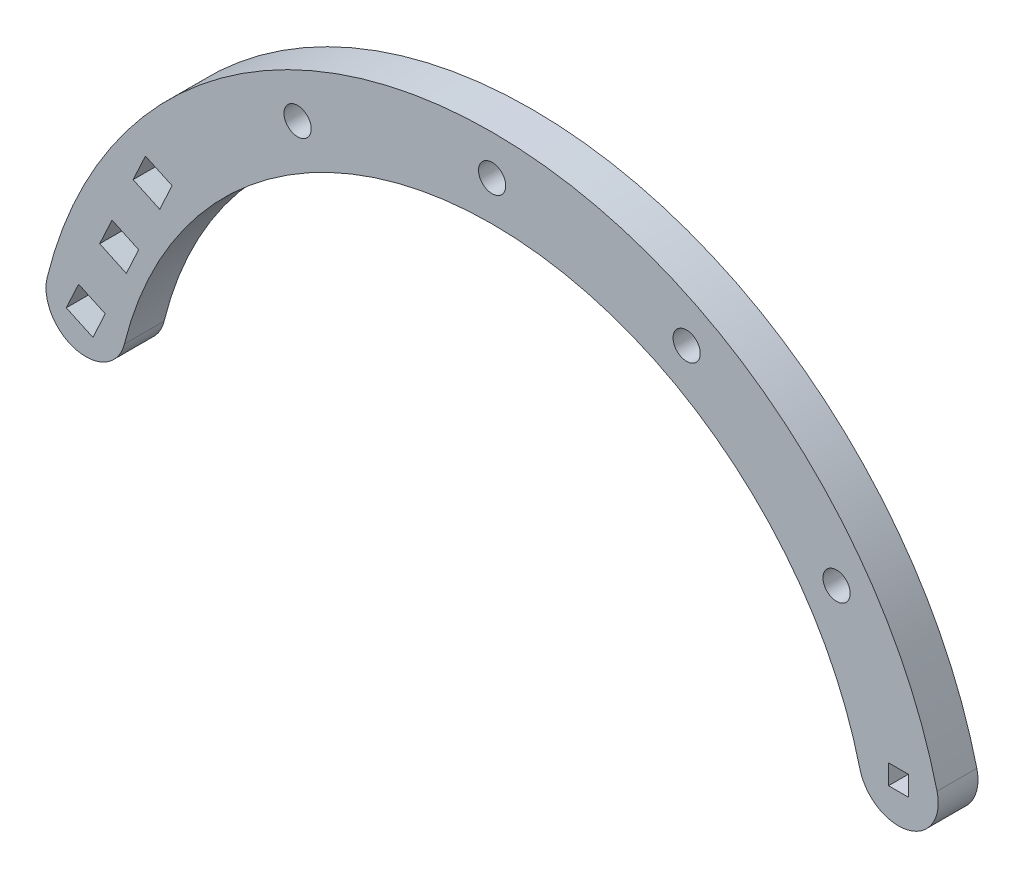
ISO-10303-21;
HEADER;
FILE_DESCRIPTION(('STEP AP214'),'2;1');
FILE_NAME('part.step','',(''),(''),'','','');
FILE_SCHEMA(('AUTOMOTIVE_DESIGN { 1 0 10303 214 1 1 1 1 }'));
ENDSEC;
DATA;
#1=APPLICATION_CONTEXT('core data for automotive mechanical design processes');
#2=APPLICATION_PROTOCOL_DEFINITION('international standard','automotive_design',2000,#1);
#3=PRODUCT_CONTEXT('',#1,'mechanical');
#4=PRODUCT('Part','Part','',(#3));
#5=PRODUCT_RELATED_PRODUCT_CATEGORY('part','',(#4));
#6=PRODUCT_DEFINITION_FORMATION('','',#4);
#7=PRODUCT_DEFINITION_CONTEXT('part definition',#1,'design');
#8=PRODUCT_DEFINITION('design','',#6,#7);
#9=PRODUCT_DEFINITION_SHAPE('','',#8);
#10=(LENGTH_UNIT() NAMED_UNIT(*) SI_UNIT(.MILLI.,.METRE.));
#11=(NAMED_UNIT(*) PLANE_ANGLE_UNIT() SI_UNIT($,.RADIAN.));
#12=(NAMED_UNIT(*) SI_UNIT($,.STERADIAN.) SOLID_ANGLE_UNIT());
#13=UNCERTAINTY_MEASURE_WITH_UNIT(LENGTH_MEASURE(1.E-05),#10,'distance_accuracy_value','');
#14=(GEOMETRIC_REPRESENTATION_CONTEXT(3) GLOBAL_UNCERTAINTY_ASSIGNED_CONTEXT((#13)) GLOBAL_UNIT_ASSIGNED_CONTEXT((#10,
#11,#12)) REPRESENTATION_CONTEXT('',''));
#15=CARTESIAN_POINT('',(0.,0.,0.));
#16=DIRECTION('',(0.,0.,1.));
#17=DIRECTION('',(1.,0.,0.));
#18=AXIS2_PLACEMENT_3D('',#15,#16,#17);
#19=CARTESIAN_POINT('',(97.32645,-8.01836804374999,6.35));
#20=DIRECTION('',(0.,0.,1.));
#21=DIRECTION('',(1.,0.,0.));
#22=AXIS2_PLACEMENT_3D('',#19,#20,#21);
#23=PLANE('',#22);
#24=CARTESIAN_POINT('',(119.889855449003,21.9308574703804,6.35));
#25=DIRECTION('',(0.,0.,1.));
#26=DIRECTION('',(1.,0.,0.));
#27=AXIS2_PLACEMENT_3D('',#24,#25,#26);
#28=CIRCLE('',#27,2.17169999999999);
#29=CARTESIAN_POINT('',(122.061555449003,21.9308574703804,6.35));
#30=VERTEX_POINT('',#29);
#31=EDGE_CURVE('E211',#30,#30,#28,.T.);
#32=ORIENTED_EDGE('',*,*,#31,.F.);
#33=EDGE_LOOP('',(#32));
#34=FACE_BOUND('',#33,.T.);
#35=CARTESIAN_POINT('',(64.8843,50.8,6.35));
#36=DIRECTION('',(0.,0.,1.));
#37=DIRECTION('',(1.,0.,0.));
#38=AXIS2_PLACEMENT_3D('',#35,#36,#37);
#39=CIRCLE('',#38,2.1717);
#40=CARTESIAN_POINT('',(67.056,50.8,6.35));
#41=VERTEX_POINT('',#40);
#42=EDGE_CURVE('E667',#41,#41,#39,.T.);
#43=ORIENTED_EDGE('',*,*,#42,.F.);
#44=EDGE_LOOP('',(#43));
#45=FACE_BOUND('',#44,.T.);
#46=CARTESIAN_POINT('',(95.944880003634,43.1442546161689,6.35));
#47=DIRECTION('',(0.,0.,1.));
#48=DIRECTION('',(1.,0.,0.));
#49=AXIS2_PLACEMENT_3D('',#46,#47,#48);
#50=CIRCLE('',#49,2.1717);
#51=CARTESIAN_POINT('',(98.116580003634,43.1442546161689,6.35));
#52=VERTEX_POINT('',#51);
#53=EDGE_CURVE('E651',#52,#52,#50,.T.);
#54=ORIENTED_EDGE('',*,*,#53,.F.);
#55=EDGE_LOOP('',(#54));
#56=FACE_BOUND('',#55,.T.);
#57=CARTESIAN_POINT('',(33.8237199963643,43.144254616172,6.35));
#58=DIRECTION('',(0.,0.,1.));
#59=DIRECTION('',(1.,0.,0.));
#60=AXIS2_PLACEMENT_3D('',#57,#58,#59);
#61=CIRCLE('',#60,2.17169999999999);
#62=CARTESIAN_POINT('',(35.9954199963643,43.144254616172,6.35));
#63=VERTEX_POINT('',#62);
#64=EDGE_CURVE('E645',#63,#63,#61,.T.);
#65=ORIENTED_EDGE('',*,*,#64,.F.);
#66=EDGE_LOOP('',(#65));
#67=FACE_BOUND('',#66,.T.);
#68=CARTESIAN_POINT('',(129.7686,0.,6.35));
#69=DIRECTION('',(0.,0.,1.));
#70=DIRECTION('',(1.,0.,0.));
#71=AXIS2_PLACEMENT_3D('',#68,#69,#70);
#72=CIRCLE('',#71,6.34999999999997);
#73=CARTESIAN_POINT('',(123.604096328537,-1.52361231437618,6.35));
#74=VERTEX_POINT('',#73);
#75=CARTESIAN_POINT('',(135.933103671463,1.52361231437615,6.35));
#76=VERTEX_POINT('',#75);
#77=EDGE_CURVE('E356',#74,#76,#72,.T.);
#78=ORIENTED_EDGE('',*,*,#77,.T.);
#79=CARTESIAN_POINT('',(64.8843,-16.0367360875,6.35));
#80=DIRECTION('',(0.,0.,1.));
#81=DIRECTION('',(1.,0.,0.));
#82=AXIS2_PLACEMENT_3D('',#79,#80,#81);
#83=CIRCLE('',#82,73.1867360874999);
#84=CARTESIAN_POINT('',(-6.16450367146296,1.52361231437616,6.35));
#85=VERTEX_POINT('',#84);
#86=EDGE_CURVE('E360',#76,#85,#83,.T.);
#87=ORIENTED_EDGE('',*,*,#86,.T.);
#88=CARTESIAN_POINT('',(0.,0.,6.35));
#89=DIRECTION('',(0.,0.,1.));
#90=DIRECTION('',(1.,0.,0.));
#91=AXIS2_PLACEMENT_3D('',#88,#89,#90);
#92=CIRCLE('',#91,6.34999999999997);
#93=CARTESIAN_POINT('',(6.164503671463,-1.52361231437617,6.35));
#94=VERTEX_POINT('',#93);
#95=EDGE_CURVE('E364',#85,#94,#92,.T.);
#96=ORIENTED_EDGE('',*,*,#95,.T.);
#97=CARTESIAN_POINT('',(64.8843,-16.0367360875,6.35));
#98=DIRECTION('',(0.,0.,-1.));
#99=DIRECTION('',(1.,0.,0.));
#100=AXIS2_PLACEMENT_3D('',#97,#98,#99);
#101=CIRCLE('',#100,60.4867360875);
#102=EDGE_CURVE('E367',#94,#74,#101,.T.);
#103=ORIENTED_EDGE('',*,*,#102,.T.);
#104=EDGE_LOOP('',(#78,#87,#96,#103));
#105=FACE_BOUND('',#104,.T.);
#106=DIRECTION('',(-1.,0.,0.));
#107=VECTOR('',#106,1.);
#108=CARTESIAN_POINT('',(128.1811,1.5875,6.35));
#109=LINE('',#108,#107);
#110=CARTESIAN_POINT('',(131.3561,1.5875,6.35));
#111=VERTEX_POINT('',#110);
#112=CARTESIAN_POINT('',(128.1811,1.5875,6.35));
#113=VERTEX_POINT('',#112);
#114=EDGE_CURVE('E316',#111,#113,#109,.T.);
#115=ORIENTED_EDGE('',*,*,#114,.F.);
#116=DIRECTION('',(0.,1.,0.));
#117=VECTOR('',#116,1.);
#118=CARTESIAN_POINT('',(131.3561,1.5875,6.35));
#119=LINE('',#118,#117);
#120=CARTESIAN_POINT('',(131.3561,-1.5875,6.35));
#121=VERTEX_POINT('',#120);
#122=EDGE_CURVE('E313',#121,#111,#119,.T.);
#123=ORIENTED_EDGE('',*,*,#122,.F.);
#124=DIRECTION('',(1.,0.,0.));
#125=VECTOR('',#124,1.);
#126=CARTESIAN_POINT('',(128.1811,-1.5875,6.35));
#127=LINE('',#126,#125);
#128=CARTESIAN_POINT('',(128.1811,-1.5875,6.35));
#129=VERTEX_POINT('',#128);
#130=EDGE_CURVE('E324',#129,#121,#127,.T.);
#131=ORIENTED_EDGE('',*,*,#130,.F.);
#132=DIRECTION('',(0.,-1.,0.));
#133=VECTOR('',#132,1.);
#134=CARTESIAN_POINT('',(128.1811,1.5875,6.35));
#135=LINE('',#134,#133);
#136=EDGE_CURVE('E320',#113,#129,#135,.T.);
#137=ORIENTED_EDGE('',*,*,#136,.F.);
#138=EDGE_LOOP('',(#115,#123,#131,#137));
#139=FACE_BOUND('',#138,.T.);
#140=DIRECTION('',(-0.907509263750891,0.420032065688222,0.));
#141=VECTOR('',#140,1.);
#142=CARTESIAN_POINT('',(-1.14249534054006,3.11134508298281,6.35));
#143=LINE('',#142,#141);
#144=CARTESIAN_POINT('',(3.11134508298281,1.14249534054004,6.35));
#145=VERTEX_POINT('',#144);
#146=CARTESIAN_POINT('',(-1.14249534054006,3.11134508298281,6.35));
#147=VERTEX_POINT('',#146);
#148=EDGE_CURVE('E273',#145,#147,#143,.T.);
#149=ORIENTED_EDGE('',*,*,#148,.F.);
#150=DIRECTION('',(0.420032065688224,0.907509263750891,0.));
#151=VECTOR('',#150,1.);
#152=CARTESIAN_POINT('',(3.11134508298281,1.14249534054004,6.35));
#153=LINE('',#152,#151);
#154=CARTESIAN_POINT('',(1.14249534054003,-3.11134508298283,6.35));
#155=VERTEX_POINT('',#154);
#156=EDGE_CURVE('E270',#155,#145,#153,.T.);
#157=ORIENTED_EDGE('',*,*,#156,.F.);
#158=DIRECTION('',(0.907509263750891,-0.420032065688222,0.));
#159=VECTOR('',#158,1.);
#160=CARTESIAN_POINT('',(-3.11134508298284,-1.14249534054006,6.35));
#161=LINE('',#160,#159);
#162=CARTESIAN_POINT('',(-3.11134508298284,-1.14249534054007,6.35));
#163=VERTEX_POINT('',#162);
#164=EDGE_CURVE('E281',#163,#155,#161,.T.);
#165=ORIENTED_EDGE('',*,*,#164,.F.);
#166=DIRECTION('',(-0.420032065688223,-0.907509263750891,0.));
#167=VECTOR('',#166,1.);
#168=CARTESIAN_POINT('',(-1.14249534054006,3.11134508298281,6.35));
#169=LINE('',#168,#167);
#170=EDGE_CURVE('E277',#147,#163,#169,.T.);
#171=ORIENTED_EDGE('',*,*,#170,.F.);
#172=EDGE_LOOP('',(#149,#157,#165,#171));
#173=FACE_BOUND('',#172,.T.);
#174=DIRECTION('',(0.420032065688224,0.907509263750891,0.));
#175=VECTOR('',#174,1.);
#176=CARTESIAN_POINT('',(8.44575261120674,12.6678632248463,6.35));
#177=LINE('',#176,#175);
#178=CARTESIAN_POINT('',(6.47690272744515,8.41402249599407,6.35));
#179=VERTEX_POINT('',#178);
#180=CARTESIAN_POINT('',(8.44575261120674,12.6678632248463,6.35));
#181=VERTEX_POINT('',#180);
#182=EDGE_CURVE('E230',#179,#181,#177,.T.);
#183=ORIENTED_EDGE('',*,*,#182,.F.);
#184=DIRECTION('',(0.907509263750891,-0.420032065688224,0.));
#185=VECTOR('',#184,1.);
#186=CARTESIAN_POINT('',(2.22306199859291,10.3828723797557,6.35));
#187=LINE('',#186,#185);
#188=CARTESIAN_POINT('',(2.22306199859291,10.3828723797557,6.35));
#189=VERTEX_POINT('',#188);
#190=EDGE_CURVE('E227',#189,#179,#187,.T.);
#191=ORIENTED_EDGE('',*,*,#190,.F.);
#192=DIRECTION('',(-0.420032065688223,-0.907509263750891,0.));
#193=VECTOR('',#192,1.);
#194=CARTESIAN_POINT('',(4.1919118823545,14.6367131086079,6.35));
#195=LINE('',#194,#193);
#196=CARTESIAN_POINT('',(4.19191188235448,14.6367131086079,6.35));
#197=VERTEX_POINT('',#196);
#198=EDGE_CURVE('E238',#197,#189,#195,.T.);
#199=ORIENTED_EDGE('',*,*,#198,.F.);
#200=DIRECTION('',(-0.907509263750891,0.420032065688223,0.));
#201=VECTOR('',#200,1.);
#202=CARTESIAN_POINT('',(4.1919118823545,14.6367131086079,6.35));
#203=LINE('',#202,#201);
#204=EDGE_CURVE('E234',#181,#197,#203,.T.);
#205=ORIENTED_EDGE('',*,*,#204,.F.);
#206=EDGE_LOOP('',(#183,#191,#199,#205));
#207=FACE_BOUND('',#206,.T.);
#208=DIRECTION('',(0.420032065688209,0.907509263750898,0.));
#209=VECTOR('',#208,1.);
#210=CARTESIAN_POINT('',(13.780159856793,24.1932304984939,6.35));
#211=LINE('',#210,#209);
#212=CARTESIAN_POINT('',(11.8113101143503,19.939390074971,6.35));
#213=VERTEX_POINT('',#212);
#214=CARTESIAN_POINT('',(13.780159856793,24.1932304984939,6.35));
#215=VERTEX_POINT('',#214);
#216=EDGE_CURVE('E186',#213,#215,#211,.T.);
#217=ORIENTED_EDGE('',*,*,#216,.F.);
#218=DIRECTION('',(0.907509263750891,-0.420032065688223,0.));
#219=VECTOR('',#218,1.);
#220=CARTESIAN_POINT('',(7.5574690801687,21.9082401000514,6.35));
#221=LINE('',#220,#219);
#222=CARTESIAN_POINT('',(7.5574690801687,21.9082401000514,6.35));
#223=VERTEX_POINT('',#222);
#224=EDGE_CURVE('E177',#223,#213,#221,.T.);
#225=ORIENTED_EDGE('',*,*,#224,.F.);
#226=DIRECTION('',(-0.420032195965406,-0.90750920345332,0.));
#227=VECTOR('',#226,1.);
#228=CARTESIAN_POINT('',(9.52631971590778,26.1620808515953,6.35));
#229=LINE('',#228,#227);
#230=CARTESIAN_POINT('',(9.52631971590778,26.1620808515953,6.35));
#231=VERTEX_POINT('',#230);
#232=EDGE_CURVE('E203',#231,#223,#229,.T.);
#233=ORIENTED_EDGE('',*,*,#232,.F.);
#234=DIRECTION('',(-0.907509203453318,0.42003219596541,0.));
#235=VECTOR('',#234,1.);
#236=CARTESIAN_POINT('',(9.52631971590778,26.1620808515953,6.35));
#237=LINE('',#236,#235);
#238=EDGE_CURVE('E199',#215,#231,#237,.T.);
#239=ORIENTED_EDGE('',*,*,#238,.F.);
#240=EDGE_LOOP('',(#217,#225,#233,#239));
#241=FACE_BOUND('',#240,.T.);
#242=ADVANCED_FACE('F39',(#34,#45,#56,#67,#105,#139,#173,#207,#241),#23,.T.);
#243=CARTESIAN_POINT('',(97.32645,-8.01836804374999,0.));
#244=DIRECTION('',(0.,0.,1.));
#245=DIRECTION('',(1.,0.,0.));
#246=AXIS2_PLACEMENT_3D('',#243,#244,#245);
#247=PLANE('',#246);
#248=CARTESIAN_POINT('',(119.889855449003,21.9308574703804,0.));
#249=DIRECTION('',(0.,0.,-1.));
#250=DIRECTION('',(-1.,0.,0.));
#251=AXIS2_PLACEMENT_3D('',#248,#249,#250);
#252=CIRCLE('',#251,2.17169999999999);
#253=CARTESIAN_POINT('',(117.718155449003,21.9308574703804,0.));
#254=VERTEX_POINT('',#253);
#255=EDGE_CURVE('E643',#254,#254,#252,.T.);
#256=ORIENTED_EDGE('',*,*,#255,.F.);
#257=EDGE_LOOP('',(#256));
#258=FACE_BOUND('',#257,.T.);
#259=CARTESIAN_POINT('',(64.8843,50.8,0.));
#260=DIRECTION('',(0.,0.,-1.));
#261=DIRECTION('',(-1.,0.,0.));
#262=AXIS2_PLACEMENT_3D('',#259,#260,#261);
#263=CIRCLE('',#262,2.1717);
#264=CARTESIAN_POINT('',(62.7126,50.8,0.));
#265=VERTEX_POINT('',#264);
#266=EDGE_CURVE('E646',#265,#265,#263,.T.);
#267=ORIENTED_EDGE('',*,*,#266,.F.);
#268=EDGE_LOOP('',(#267));
#269=FACE_BOUND('',#268,.T.);
#270=CARTESIAN_POINT('',(95.944880003634,43.1442546161689,0.));
#271=DIRECTION('',(0.,0.,-1.));
#272=DIRECTION('',(-1.,0.,0.));
#273=AXIS2_PLACEMENT_3D('',#270,#271,#272);
#274=CIRCLE('',#273,2.1717);
#275=CARTESIAN_POINT('',(93.773180003634,43.1442546161689,0.));
#276=VERTEX_POINT('',#275);
#277=EDGE_CURVE('E654',#276,#276,#274,.T.);
#278=ORIENTED_EDGE('',*,*,#277,.F.);
#279=EDGE_LOOP('',(#278));
#280=FACE_BOUND('',#279,.T.);
#281=CARTESIAN_POINT('',(33.8237199963643,43.144254616172,0.));
#282=DIRECTION('',(0.,0.,-1.));
#283=DIRECTION('',(-1.,0.,0.));
#284=AXIS2_PLACEMENT_3D('',#281,#282,#283);
#285=CIRCLE('',#284,2.17169999999999);
#286=CARTESIAN_POINT('',(31.6520199963643,43.144254616172,0.));
#287=VERTEX_POINT('',#286);
#288=EDGE_CURVE('E660',#287,#287,#285,.T.);
#289=ORIENTED_EDGE('',*,*,#288,.F.);
#290=EDGE_LOOP('',(#289));
#291=FACE_BOUND('',#290,.T.);
#292=DIRECTION('',(0.907509263750891,-0.420032065688224,0.));
#293=VECTOR('',#292,1.);
#294=CARTESIAN_POINT('',(2.22306199859291,10.3828723797557,0.));
#295=LINE('',#294,#293);
#296=CARTESIAN_POINT('',(2.2230619985929,10.3828723797557,0.));
#297=VERTEX_POINT('',#296);
#298=CARTESIAN_POINT('',(6.47690272744515,8.41402249599407,0.));
#299=VERTEX_POINT('',#298);
#300=EDGE_CURVE('E195',#297,#299,#295,.T.);
#301=ORIENTED_EDGE('',*,*,#300,.T.);
#302=DIRECTION('',(0.420032065688224,0.907509263750891,0.));
#303=VECTOR('',#302,1.);
#304=CARTESIAN_POINT('',(8.44575261120674,12.6678632248463,0.));
#305=LINE('',#304,#303);
#306=CARTESIAN_POINT('',(8.44575261120674,12.6678632248463,0.));
#307=VERTEX_POINT('',#306);
#308=EDGE_CURVE('E245',#299,#307,#305,.T.);
#309=ORIENTED_EDGE('',*,*,#308,.T.);
#310=DIRECTION('',(-0.907509263750891,0.420032065688223,0.));
#311=VECTOR('',#310,1.);
#312=CARTESIAN_POINT('',(4.1919118823545,14.6367131086079,0.));
#313=LINE('',#312,#311);
#314=CARTESIAN_POINT('',(4.1919118823545,14.6367131086079,0.));
#315=VERTEX_POINT('',#314);
#316=EDGE_CURVE('E249',#307,#315,#313,.T.);
#317=ORIENTED_EDGE('',*,*,#316,.T.);
#318=DIRECTION('',(-0.420032065688223,-0.907509263750891,0.));
#319=VECTOR('',#318,1.);
#320=CARTESIAN_POINT('',(4.1919118823545,14.6367131086079,0.));
#321=LINE('',#320,#319);
#322=EDGE_CURVE('E231',#315,#297,#321,.T.);
#323=ORIENTED_EDGE('',*,*,#322,.T.);
#324=EDGE_LOOP('',(#301,#309,#317,#323));
#325=FACE_BOUND('',#324,.T.);
#326=DIRECTION('',(0.,1.,0.));
#327=VECTOR('',#326,1.);
#328=CARTESIAN_POINT('',(131.3561,1.5875,0.));
#329=LINE('',#328,#327);
#330=CARTESIAN_POINT('',(131.3561,-1.5875,0.));
#331=VERTEX_POINT('',#330);
#332=CARTESIAN_POINT('',(131.3561,1.5875,0.));
#333=VERTEX_POINT('',#332);
#334=EDGE_CURVE('E312',#331,#333,#329,.T.);
#335=ORIENTED_EDGE('',*,*,#334,.T.);
#336=DIRECTION('',(-1.,0.,0.));
#337=VECTOR('',#336,1.);
#338=CARTESIAN_POINT('',(128.1811,1.5875,0.));
#339=LINE('',#338,#337);
#340=CARTESIAN_POINT('',(128.1811,1.5875,0.));
#341=VERTEX_POINT('',#340);
#342=EDGE_CURVE('E331',#333,#341,#339,.T.);
#343=ORIENTED_EDGE('',*,*,#342,.T.);
#344=DIRECTION('',(0.,-1.,0.));
#345=VECTOR('',#344,1.);
#346=CARTESIAN_POINT('',(128.1811,1.5875,0.));
#347=LINE('',#346,#345);
#348=CARTESIAN_POINT('',(128.1811,-1.5875,0.));
#349=VERTEX_POINT('',#348);
#350=EDGE_CURVE('E335',#341,#349,#347,.T.);
#351=ORIENTED_EDGE('',*,*,#350,.T.);
#352=DIRECTION('',(1.,0.,0.));
#353=VECTOR('',#352,1.);
#354=CARTESIAN_POINT('',(128.1811,-1.5875,0.));
#355=LINE('',#354,#353);
#356=EDGE_CURVE('E317',#349,#331,#355,.T.);
#357=ORIENTED_EDGE('',*,*,#356,.T.);
#358=EDGE_LOOP('',(#335,#343,#351,#357));
#359=FACE_BOUND('',#358,.T.);
#360=CARTESIAN_POINT('',(129.7686,0.,0.));
#361=DIRECTION('',(0.,0.,1.));
#362=DIRECTION('',(1.,0.,0.));
#363=AXIS2_PLACEMENT_3D('',#360,#361,#362);
#364=CIRCLE('',#363,6.34999999999997);
#365=CARTESIAN_POINT('',(123.604096328537,-1.52361231437618,0.));
#366=VERTEX_POINT('',#365);
#367=CARTESIAN_POINT('',(135.933103671463,1.52361231437615,0.));
#368=VERTEX_POINT('',#367);
#369=EDGE_CURVE('E355',#366,#368,#364,.T.);
#370=ORIENTED_EDGE('',*,*,#369,.F.);
#371=CARTESIAN_POINT('',(64.8843,-16.0367360875,0.));
#372=DIRECTION('',(0.,0.,-1.));
#373=DIRECTION('',(1.,0.,0.));
#374=AXIS2_PLACEMENT_3D('',#371,#372,#373);
#375=CIRCLE('',#374,60.4867360875);
#376=CARTESIAN_POINT('',(6.164503671463,-1.52361231437617,0.));
#377=VERTEX_POINT('',#376);
#378=EDGE_CURVE('E361',#377,#366,#375,.T.);
#379=ORIENTED_EDGE('',*,*,#378,.F.);
#380=CARTESIAN_POINT('',(0.,0.,0.));
#381=DIRECTION('',(0.,0.,1.));
#382=DIRECTION('',(1.,0.,0.));
#383=AXIS2_PLACEMENT_3D('',#380,#381,#382);
#384=CIRCLE('',#383,6.34999999999997);
#385=CARTESIAN_POINT('',(-6.16450367146296,1.52361231437616,0.));
#386=VERTEX_POINT('',#385);
#387=EDGE_CURVE('E377',#386,#377,#384,.T.);
#388=ORIENTED_EDGE('',*,*,#387,.F.);
#389=CARTESIAN_POINT('',(64.8843,-16.0367360875,0.));
#390=DIRECTION('',(0.,0.,1.));
#391=DIRECTION('',(1.,0.,0.));
#392=AXIS2_PLACEMENT_3D('',#389,#390,#391);
#393=CIRCLE('',#392,73.1867360874999);
#394=EDGE_CURVE('E374',#368,#386,#393,.T.);
#395=ORIENTED_EDGE('',*,*,#394,.F.);
#396=EDGE_LOOP('',(#370,#379,#388,#395));
#397=FACE_BOUND('',#396,.T.);
#398=DIRECTION('',(0.420032065688224,0.907509263750891,0.));
#399=VECTOR('',#398,1.);
#400=CARTESIAN_POINT('',(3.11134508298281,1.14249534054004,0.));
#401=LINE('',#400,#399);
#402=CARTESIAN_POINT('',(1.14249534054002,-3.11134508298284,0.));
#403=VERTEX_POINT('',#402);
#404=CARTESIAN_POINT('',(3.11134508298281,1.14249534054004,0.));
#405=VERTEX_POINT('',#404);
#406=EDGE_CURVE('E269',#403,#405,#401,.T.);
#407=ORIENTED_EDGE('',*,*,#406,.T.);
#408=DIRECTION('',(-0.907509263750891,0.420032065688222,0.));
#409=VECTOR('',#408,1.);
#410=CARTESIAN_POINT('',(-1.14249534054006,3.11134508298281,0.));
#411=LINE('',#410,#409);
#412=CARTESIAN_POINT('',(-1.14249534054006,3.11134508298281,0.));
#413=VERTEX_POINT('',#412);
#414=EDGE_CURVE('E288',#405,#413,#411,.T.);
#415=ORIENTED_EDGE('',*,*,#414,.T.);
#416=DIRECTION('',(-0.420032065688223,-0.907509263750891,0.));
#417=VECTOR('',#416,1.);
#418=CARTESIAN_POINT('',(-1.14249534054006,3.11134508298281,0.));
#419=LINE('',#418,#417);
#420=CARTESIAN_POINT('',(-3.11134508298284,-1.14249534054006,0.));
#421=VERTEX_POINT('',#420);
#422=EDGE_CURVE('E292',#413,#421,#419,.T.);
#423=ORIENTED_EDGE('',*,*,#422,.T.);
#424=DIRECTION('',(0.907509263750891,-0.420032065688222,0.));
#425=VECTOR('',#424,1.);
#426=CARTESIAN_POINT('',(-3.11134508298284,-1.14249534054006,0.));
#427=LINE('',#426,#425);
#428=EDGE_CURVE('E274',#421,#403,#427,.T.);
#429=ORIENTED_EDGE('',*,*,#428,.T.);
#430=EDGE_LOOP('',(#407,#415,#423,#429));
#431=FACE_BOUND('',#430,.T.);
#432=DIRECTION('',(0.907509263750891,-0.420032065688223,0.));
#433=VECTOR('',#432,1.);
#434=CARTESIAN_POINT('',(7.5574690801687,21.9082401000514,0.));
#435=LINE('',#434,#433);
#436=CARTESIAN_POINT('',(7.5574690801687,21.9082401000514,0.));
#437=VERTEX_POINT('',#436);
#438=CARTESIAN_POINT('',(11.8113101143503,19.939390074971,0.));
#439=VERTEX_POINT('',#438);
#440=EDGE_CURVE('E63',#437,#439,#435,.T.);
#441=ORIENTED_EDGE('',*,*,#440,.T.);
#442=DIRECTION('',(0.420032065688209,0.907509263750898,0.));
#443=VECTOR('',#442,1.);
#444=CARTESIAN_POINT('',(13.780159856793,24.1932304984939,0.));
#445=LINE('',#444,#443);
#446=CARTESIAN_POINT('',(13.780159856793,24.1932304984939,0.));
#447=VERTEX_POINT('',#446);
#448=EDGE_CURVE('E193',#439,#447,#445,.T.);
#449=ORIENTED_EDGE('',*,*,#448,.T.);
#450=DIRECTION('',(-0.907509203453318,0.42003219596541,0.));
#451=VECTOR('',#450,1.);
#452=CARTESIAN_POINT('',(9.52631971590778,26.1620808515953,0.));
#453=LINE('',#452,#451);
#454=CARTESIAN_POINT('',(9.52631971590778,26.1620808515953,0.));
#455=VERTEX_POINT('',#454);
#456=EDGE_CURVE('E214',#447,#455,#453,.T.);
#457=ORIENTED_EDGE('',*,*,#456,.T.);
#458=DIRECTION('',(-0.420032195965406,-0.90750920345332,0.));
#459=VECTOR('',#458,1.);
#460=CARTESIAN_POINT('',(9.52631971590778,26.1620808515953,0.));
#461=LINE('',#460,#459);
#462=EDGE_CURVE('E187',#455,#437,#461,.T.);
#463=ORIENTED_EDGE('',*,*,#462,.T.);
#464=EDGE_LOOP('',(#441,#449,#457,#463));
#465=FACE_BOUND('',#464,.T.);
#466=ADVANCED_FACE('F400',(#258,#269,#280,#291,#325,#359,#397,#431,#465),#247,.F.);
#467=CARTESIAN_POINT('',(129.7686,0.,6.35));
#468=DIRECTION('',(0.,0.,-1.));
#469=DIRECTION('',(-1.,0.,0.));
#470=AXIS2_PLACEMENT_3D('',#467,#468,#469);
#471=CYLINDRICAL_SURFACE('',#470,6.34999999999997);
#472=ORIENTED_EDGE('',*,*,#369,.T.);
#473=DIRECTION('',(0.,0.,-1.));
#474=VECTOR('',#473,1.);
#475=CARTESIAN_POINT('',(135.933103671463,1.52361231437615,6.35));
#476=LINE('',#475,#474);
#477=EDGE_CURVE('E11',#76,#368,#476,.T.);
#478=ORIENTED_EDGE('',*,*,#477,.F.);
#479=ORIENTED_EDGE('',*,*,#77,.F.);
#480=DIRECTION('',(0.,0.,-1.));
#481=VECTOR('',#480,1.);
#482=CARTESIAN_POINT('',(123.604096328537,-1.52361231437618,6.35));
#483=LINE('',#482,#481);
#484=EDGE_CURVE('E370',#74,#366,#483,.T.);
#485=ORIENTED_EDGE('',*,*,#484,.T.);
#486=EDGE_LOOP('',(#472,#478,#479,#485));
#487=FACE_BOUND('',#486,.T.);
#488=ADVANCED_FACE('F41',(#487),#471,.T.);
#489=CARTESIAN_POINT('',(64.8843,-16.0367360875,6.35));
#490=DIRECTION('',(0.,0.,-1.));
#491=DIRECTION('',(-1.,0.,0.));
#492=AXIS2_PLACEMENT_3D('',#489,#490,#491);
#493=CYLINDRICAL_SURFACE('',#492,73.1867360874999);
#494=ORIENTED_EDGE('',*,*,#394,.T.);
#495=DIRECTION('',(0.,0.,-1.));
#496=VECTOR('',#495,1.);
#497=CARTESIAN_POINT('',(-6.16450367146296,1.52361231437616,6.35));
#498=LINE('',#497,#496);
#499=EDGE_CURVE('E48',#85,#386,#498,.T.);
#500=ORIENTED_EDGE('',*,*,#499,.F.);
#501=ORIENTED_EDGE('',*,*,#86,.F.);
#502=ORIENTED_EDGE('',*,*,#477,.T.);
#503=EDGE_LOOP('',(#494,#500,#501,#502));
#504=FACE_BOUND('',#503,.T.);
#505=ADVANCED_FACE('F411',(#504),#493,.T.);
#506=CARTESIAN_POINT('',(0.,0.,6.35));
#507=DIRECTION('',(0.,0.,-1.));
#508=DIRECTION('',(-1.,0.,0.));
#509=AXIS2_PLACEMENT_3D('',#506,#507,#508);
#510=CYLINDRICAL_SURFACE('',#509,6.34999999999997);
#511=ORIENTED_EDGE('',*,*,#387,.T.);
#512=DIRECTION('',(0.,0.,-1.));
#513=VECTOR('',#512,1.);
#514=CARTESIAN_POINT('',(6.164503671463,-1.52361231437617,6.35));
#515=LINE('',#514,#513);
#516=EDGE_CURVE('E385',#94,#377,#515,.T.);
#517=ORIENTED_EDGE('',*,*,#516,.F.);
#518=ORIENTED_EDGE('',*,*,#95,.F.);
#519=ORIENTED_EDGE('',*,*,#499,.T.);
#520=EDGE_LOOP('',(#511,#517,#518,#519));
#521=FACE_BOUND('',#520,.T.);
#522=ADVANCED_FACE('F394',(#521),#510,.T.);
#523=CARTESIAN_POINT('',(64.8843,-16.0367360875,6.35));
#524=DIRECTION('',(0.,0.,-1.));
#525=DIRECTION('',(-1.,0.,0.));
#526=AXIS2_PLACEMENT_3D('',#523,#524,#525);
#527=CYLINDRICAL_SURFACE('',#526,60.4867360875);
#528=ORIENTED_EDGE('',*,*,#378,.T.);
#529=ORIENTED_EDGE('',*,*,#484,.F.);
#530=ORIENTED_EDGE('',*,*,#102,.F.);
#531=ORIENTED_EDGE('',*,*,#516,.T.);
#532=EDGE_LOOP('',(#528,#529,#530,#531));
#533=FACE_BOUND('',#532,.T.);
#534=ADVANCED_FACE('F404',(#533),#527,.F.);
#535=CARTESIAN_POINT('',(131.3561,1.5875,6.35));
#536=DIRECTION('',(-1.,0.,0.));
#537=DIRECTION('',(0.,0.,1.));
#538=AXIS2_PLACEMENT_3D('',#535,#536,#537);
#539=PLANE('',#538);
#540=ORIENTED_EDGE('',*,*,#334,.F.);
#541=DIRECTION('',(0.,0.,-1.));
#542=VECTOR('',#541,1.);
#543=CARTESIAN_POINT('',(131.3561,-1.5875,6.35));
#544=LINE('',#543,#542);
#545=EDGE_CURVE('E327',#121,#331,#544,.T.);
#546=ORIENTED_EDGE('',*,*,#545,.F.);
#547=ORIENTED_EDGE('',*,*,#122,.T.);
#548=DIRECTION('',(0.,0.,-1.));
#549=VECTOR('',#548,1.);
#550=CARTESIAN_POINT('',(131.3561,1.5875,6.35));
#551=LINE('',#550,#549);
#552=EDGE_CURVE('E351',#111,#333,#551,.T.);
#553=ORIENTED_EDGE('',*,*,#552,.T.);
#554=EDGE_LOOP('',(#540,#546,#547,#553));
#555=FACE_BOUND('',#554,.T.);
#556=ADVANCED_FACE('F429',(#555),#539,.T.);
#557=CARTESIAN_POINT('',(128.1811,1.5875,6.35));
#558=DIRECTION('',(0.,-1.,0.));
#559=DIRECTION('',(0.,0.,-1.));
#560=AXIS2_PLACEMENT_3D('',#557,#558,#559);
#561=PLANE('',#560);
#562=ORIENTED_EDGE('',*,*,#342,.F.);
#563=ORIENTED_EDGE('',*,*,#552,.F.);
#564=ORIENTED_EDGE('',*,*,#114,.T.);
#565=DIRECTION('',(0.,0.,-1.));
#566=VECTOR('',#565,1.);
#567=CARTESIAN_POINT('',(128.1811,1.5875,6.35));
#568=LINE('',#567,#566);
#569=EDGE_CURVE('E348',#113,#341,#568,.T.);
#570=ORIENTED_EDGE('',*,*,#569,.T.);
#571=EDGE_LOOP('',(#562,#563,#564,#570));
#572=FACE_BOUND('',#571,.T.);
#573=ADVANCED_FACE('F436',(#572),#561,.T.);
#574=CARTESIAN_POINT('',(128.1811,1.5875,6.35));
#575=DIRECTION('',(1.,0.,0.));
#576=DIRECTION('',(0.,0.,-1.));
#577=AXIS2_PLACEMENT_3D('',#574,#575,#576);
#578=PLANE('',#577);
#579=ORIENTED_EDGE('',*,*,#350,.F.);
#580=ORIENTED_EDGE('',*,*,#569,.F.);
#581=ORIENTED_EDGE('',*,*,#136,.T.);
#582=DIRECTION('',(0.,0.,-1.));
#583=VECTOR('',#582,1.);
#584=CARTESIAN_POINT('',(128.1811,-1.5875,6.35));
#585=LINE('',#584,#583);
#586=EDGE_CURVE('E345',#129,#349,#585,.T.);
#587=ORIENTED_EDGE('',*,*,#586,.T.);
#588=EDGE_LOOP('',(#579,#580,#581,#587));
#589=FACE_BOUND('',#588,.T.);
#590=ADVANCED_FACE('F441',(#589),#578,.T.);
#591=CARTESIAN_POINT('',(128.1811,-1.5875,6.35));
#592=DIRECTION('',(0.,1.,0.));
#593=DIRECTION('',(0.,0.,1.));
#594=AXIS2_PLACEMENT_3D('',#591,#592,#593);
#595=PLANE('',#594);
#596=ORIENTED_EDGE('',*,*,#356,.F.);
#597=ORIENTED_EDGE('',*,*,#586,.F.);
#598=ORIENTED_EDGE('',*,*,#130,.T.);
#599=ORIENTED_EDGE('',*,*,#545,.T.);
#600=EDGE_LOOP('',(#596,#597,#598,#599));
#601=FACE_BOUND('',#600,.T.);
#602=ADVANCED_FACE('F449',(#601),#595,.T.);
#603=CARTESIAN_POINT('',(3.11134508298281,1.14249534054004,6.35));
#604=DIRECTION('',(-0.907509263750891,0.420032065688224,0.));
#605=DIRECTION('',(-0.420032065688224,-0.907509263750891,0.));
#606=AXIS2_PLACEMENT_3D('',#603,#604,#605);
#607=PLANE('',#606);
#608=ORIENTED_EDGE('',*,*,#406,.F.);
#609=DIRECTION('',(0.,0.,-1.));
#610=VECTOR('',#609,1.);
#611=CARTESIAN_POINT('',(1.14249534054003,-3.11134508298283,6.35));
#612=LINE('',#611,#610);
#613=EDGE_CURVE('E284',#155,#403,#612,.T.);
#614=ORIENTED_EDGE('',*,*,#613,.F.);
#615=ORIENTED_EDGE('',*,*,#156,.T.);
#616=DIRECTION('',(0.,0.,-1.));
#617=VECTOR('',#616,1.);
#618=CARTESIAN_POINT('',(3.11134508298281,1.14249534054004,6.35));
#619=LINE('',#618,#617);
#620=EDGE_CURVE('E308',#145,#405,#619,.T.);
#621=ORIENTED_EDGE('',*,*,#620,.T.);
#622=EDGE_LOOP('',(#608,#614,#615,#621));
#623=FACE_BOUND('',#622,.T.);
#624=ADVANCED_FACE('F504',(#623),#607,.T.);
#625=CARTESIAN_POINT('',(-1.14249534054006,3.11134508298281,6.35));
#626=DIRECTION('',(-0.420032065688222,-0.907509263750891,0.));
#627=DIRECTION('',(0.907509263750891,-0.420032065688222,0.));
#628=AXIS2_PLACEMENT_3D('',#625,#626,#627);
#629=PLANE('',#628);
#630=ORIENTED_EDGE('',*,*,#414,.F.);
#631=ORIENTED_EDGE('',*,*,#620,.F.);
#632=ORIENTED_EDGE('',*,*,#148,.T.);
#633=DIRECTION('',(0.,0.,-1.));
#634=VECTOR('',#633,1.);
#635=CARTESIAN_POINT('',(-1.14249534054006,3.11134508298281,6.35));
#636=LINE('',#635,#634);
#637=EDGE_CURVE('E305',#147,#413,#636,.T.);
#638=ORIENTED_EDGE('',*,*,#637,.T.);
#639=EDGE_LOOP('',(#630,#631,#632,#638));
#640=FACE_BOUND('',#639,.T.);
#641=ADVANCED_FACE('F500',(#640),#629,.T.);
#642=CARTESIAN_POINT('',(-1.14249534054006,3.11134508298281,6.35));
#643=DIRECTION('',(0.907509263750891,-0.420032065688223,0.));
#644=DIRECTION('',(0.420032065688223,0.907509263750891,0.));
#645=AXIS2_PLACEMENT_3D('',#642,#643,#644);
#646=PLANE('',#645);
#647=ORIENTED_EDGE('',*,*,#422,.F.);
#648=ORIENTED_EDGE('',*,*,#637,.F.);
#649=ORIENTED_EDGE('',*,*,#170,.T.);
#650=DIRECTION('',(0.,0.,-1.));
#651=VECTOR('',#650,1.);
#652=CARTESIAN_POINT('',(-3.11134508298284,-1.14249534054006,6.35));
#653=LINE('',#652,#651);
#654=EDGE_CURVE('E302',#163,#421,#653,.T.);
#655=ORIENTED_EDGE('',*,*,#654,.T.);
#656=EDGE_LOOP('',(#647,#648,#649,#655));
#657=FACE_BOUND('',#656,.T.);
#658=ADVANCED_FACE('F496',(#657),#646,.T.);
#659=CARTESIAN_POINT('',(-3.11134508298284,-1.14249534054006,6.35));
#660=DIRECTION('',(0.420032065688222,0.907509263750891,0.));
#661=DIRECTION('',(-0.907509263750891,0.420032065688222,0.));
#662=AXIS2_PLACEMENT_3D('',#659,#660,#661);
#663=PLANE('',#662);
#664=ORIENTED_EDGE('',*,*,#428,.F.);
#665=ORIENTED_EDGE('',*,*,#654,.F.);
#666=ORIENTED_EDGE('',*,*,#164,.T.);
#667=ORIENTED_EDGE('',*,*,#613,.T.);
#668=EDGE_LOOP('',(#664,#665,#666,#667));
#669=FACE_BOUND('',#668,.T.);
#670=ADVANCED_FACE('F493',(#669),#663,.T.);
#671=CARTESIAN_POINT('',(2.22306199859291,10.3828723797557,6.35));
#672=DIRECTION('',(0.420032065688224,0.907509263750891,0.));
#673=DIRECTION('',(-0.907509263750891,0.420032065688224,0.));
#674=AXIS2_PLACEMENT_3D('',#671,#672,#673);
#675=PLANE('',#674);
#676=ORIENTED_EDGE('',*,*,#300,.F.);
#677=DIRECTION('',(0.,0.,-1.));
#678=VECTOR('',#677,1.);
#679=CARTESIAN_POINT('',(2.22306199859291,10.3828723797557,6.35));
#680=LINE('',#679,#678);
#681=EDGE_CURVE('E241',#189,#297,#680,.T.);
#682=ORIENTED_EDGE('',*,*,#681,.F.);
#683=ORIENTED_EDGE('',*,*,#190,.T.);
#684=DIRECTION('',(0.,0.,-1.));
#685=VECTOR('',#684,1.);
#686=CARTESIAN_POINT('',(6.47690272744515,8.41402249599407,6.35));
#687=LINE('',#686,#685);
#688=EDGE_CURVE('E265',#179,#299,#687,.T.);
#689=ORIENTED_EDGE('',*,*,#688,.T.);
#690=EDGE_LOOP('',(#676,#682,#683,#689));
#691=FACE_BOUND('',#690,.T.);
#692=ADVANCED_FACE('F475',(#691),#675,.T.);
#693=CARTESIAN_POINT('',(8.44575261120674,12.6678632248463,6.35));
#694=DIRECTION('',(-0.90750926375089,0.420032065688224,0.));
#695=DIRECTION('',(-0.420032065688224,-0.907509263750891,0.));
#696=AXIS2_PLACEMENT_3D('',#693,#694,#695);
#697=PLANE('',#696);
#698=ORIENTED_EDGE('',*,*,#308,.F.);
#699=ORIENTED_EDGE('',*,*,#688,.F.);
#700=ORIENTED_EDGE('',*,*,#182,.T.);
#701=DIRECTION('',(0.,0.,-1.));
#702=VECTOR('',#701,1.);
#703=CARTESIAN_POINT('',(8.44575261120674,12.6678632248463,6.35));
#704=LINE('',#703,#702);
#705=EDGE_CURVE('E262',#181,#307,#704,.T.);
#706=ORIENTED_EDGE('',*,*,#705,.T.);
#707=EDGE_LOOP('',(#698,#699,#700,#706));
#708=FACE_BOUND('',#707,.T.);
#709=ADVANCED_FACE('F468',(#708),#697,.T.);
#710=CARTESIAN_POINT('',(4.1919118823545,14.6367131086079,6.35));
#711=DIRECTION('',(-0.420032065688223,-0.907509263750891,0.));
#712=DIRECTION('',(0.907509263750891,-0.420032065688223,0.));
#713=AXIS2_PLACEMENT_3D('',#710,#711,#712);
#714=PLANE('',#713);
#715=ORIENTED_EDGE('',*,*,#316,.F.);
#716=ORIENTED_EDGE('',*,*,#705,.F.);
#717=ORIENTED_EDGE('',*,*,#204,.T.);
#718=DIRECTION('',(0.,0.,-1.));
#719=VECTOR('',#718,1.);
#720=CARTESIAN_POINT('',(4.1919118823545,14.6367131086079,6.35));
#721=LINE('',#720,#719);
#722=EDGE_CURVE('E259',#197,#315,#721,.T.);
#723=ORIENTED_EDGE('',*,*,#722,.T.);
#724=EDGE_LOOP('',(#715,#716,#717,#723));
#725=FACE_BOUND('',#724,.T.);
#726=ADVANCED_FACE('F471',(#725),#714,.T.);
#727=CARTESIAN_POINT('',(4.1919118823545,14.6367131086079,6.35));
#728=DIRECTION('',(0.907509263750891,-0.420032065688223,0.));
#729=DIRECTION('',(0.420032065688223,0.907509263750891,0.));
#730=AXIS2_PLACEMENT_3D('',#727,#728,#729);
#731=PLANE('',#730);
#732=ORIENTED_EDGE('',*,*,#322,.F.);
#733=ORIENTED_EDGE('',*,*,#722,.F.);
#734=ORIENTED_EDGE('',*,*,#198,.T.);
#735=ORIENTED_EDGE('',*,*,#681,.T.);
#736=EDGE_LOOP('',(#732,#733,#734,#735));
#737=FACE_BOUND('',#736,.T.);
#738=ADVANCED_FACE('F478',(#737),#731,.T.);
#739=CARTESIAN_POINT('',(7.5574690801687,21.9082401000514,6.35));
#740=DIRECTION('',(0.420032065688223,0.907509263750891,0.));
#741=DIRECTION('',(-0.907509263750891,0.420032065688223,0.));
#742=AXIS2_PLACEMENT_3D('',#739,#740,#741);
#743=PLANE('',#742);
#744=ORIENTED_EDGE('',*,*,#440,.F.);
#745=DIRECTION('',(0.,0.,-1.));
#746=VECTOR('',#745,1.);
#747=CARTESIAN_POINT('',(7.5574690801687,21.9082401000514,6.35));
#748=LINE('',#747,#746);
#749=EDGE_CURVE('E181',#223,#437,#748,.T.);
#750=ORIENTED_EDGE('',*,*,#749,.F.);
#751=ORIENTED_EDGE('',*,*,#224,.T.);
#752=DIRECTION('',(0.,0.,-1.));
#753=VECTOR('',#752,1.);
#754=CARTESIAN_POINT('',(11.8113101143503,19.939390074971,6.35));
#755=LINE('',#754,#753);
#756=EDGE_CURVE('E180',#213,#439,#755,.T.);
#757=ORIENTED_EDGE('',*,*,#756,.T.);
#758=EDGE_LOOP('',(#744,#750,#751,#757));
#759=FACE_BOUND('',#758,.T.);
#760=ADVANCED_FACE('F179',(#759),#743,.T.);
#761=CARTESIAN_POINT('',(13.780159856793,24.1932304984939,6.35));
#762=DIRECTION('',(-0.907509263750898,0.420032065688209,0.));
#763=DIRECTION('',(-0.420032065688209,-0.907509263750898,0.));
#764=AXIS2_PLACEMENT_3D('',#761,#762,#763);
#765=PLANE('',#764);
#766=ORIENTED_EDGE('',*,*,#448,.F.);
#767=ORIENTED_EDGE('',*,*,#756,.F.);
#768=ORIENTED_EDGE('',*,*,#216,.T.);
#769=DIRECTION('',(0.,0.,-1.));
#770=VECTOR('',#769,1.);
#771=CARTESIAN_POINT('',(13.780159856793,24.1932304984939,6.35));
#772=LINE('',#771,#770);
#773=EDGE_CURVE('E196',#215,#447,#772,.T.);
#774=ORIENTED_EDGE('',*,*,#773,.T.);
#775=EDGE_LOOP('',(#766,#767,#768,#774));
#776=FACE_BOUND('',#775,.T.);
#777=ADVANCED_FACE('F190',(#776),#765,.T.);
#778=CARTESIAN_POINT('',(9.52631971590778,26.1620808515953,6.35));
#779=DIRECTION('',(-0.42003219596541,-0.907509203453318,0.));
#780=DIRECTION('',(0.907509203453318,-0.42003219596541,0.));
#781=AXIS2_PLACEMENT_3D('',#778,#779,#780);
#782=PLANE('',#781);
#783=ORIENTED_EDGE('',*,*,#456,.F.);
#784=ORIENTED_EDGE('',*,*,#773,.F.);
#785=ORIENTED_EDGE('',*,*,#238,.T.);
#786=DIRECTION('',(0.,0.,-1.));
#787=VECTOR('',#786,1.);
#788=CARTESIAN_POINT('',(9.52631971590778,26.1620808515953,6.35));
#789=LINE('',#788,#787);
#790=EDGE_CURVE('E55',#231,#455,#789,.T.);
#791=ORIENTED_EDGE('',*,*,#790,.T.);
#792=EDGE_LOOP('',(#783,#784,#785,#791));
#793=FACE_BOUND('',#792,.T.);
#794=ADVANCED_FACE('F567',(#793),#782,.T.);
#795=CARTESIAN_POINT('',(9.52631971590778,26.1620808515953,6.35));
#796=DIRECTION('',(0.90750920345332,-0.420032195965406,0.));
#797=DIRECTION('',(0.420032195965406,0.90750920345332,0.));
#798=AXIS2_PLACEMENT_3D('',#795,#796,#797);
#799=PLANE('',#798);
#800=ORIENTED_EDGE('',*,*,#462,.F.);
#801=ORIENTED_EDGE('',*,*,#790,.F.);
#802=ORIENTED_EDGE('',*,*,#232,.T.);
#803=ORIENTED_EDGE('',*,*,#749,.T.);
#804=EDGE_LOOP('',(#800,#801,#802,#803));
#805=FACE_BOUND('',#804,.T.);
#806=ADVANCED_FACE('F575',(#805),#799,.T.);
#807=CARTESIAN_POINT('',(33.8237199963643,43.144254616172,25.4));
#808=DIRECTION('',(0.,0.,-1.));
#809=DIRECTION('',(-1.,0.,0.));
#810=AXIS2_PLACEMENT_3D('',#807,#808,#809);
#811=CYLINDRICAL_SURFACE('',#810,2.17169999999999);
#812=ORIENTED_EDGE('',*,*,#64,.T.);
#813=EDGE_LOOP('',(#812));
#814=FACE_BOUND('',#813,.T.);
#815=ORIENTED_EDGE('',*,*,#288,.T.);
#816=EDGE_LOOP('',(#815));
#817=FACE_BOUND('',#816,.T.);
#818=ADVANCED_FACE('F584',(#814,#817),#811,.F.);
#819=CARTESIAN_POINT('',(95.944880003634,43.1442546161689,25.4));
#820=DIRECTION('',(0.,0.,-1.));
#821=DIRECTION('',(-1.,0.,0.));
#822=AXIS2_PLACEMENT_3D('',#819,#820,#821);
#823=CYLINDRICAL_SURFACE('',#822,2.1717);
#824=ORIENTED_EDGE('',*,*,#53,.T.);
#825=EDGE_LOOP('',(#824));
#826=FACE_BOUND('',#825,.T.);
#827=ORIENTED_EDGE('',*,*,#277,.T.);
#828=EDGE_LOOP('',(#827));
#829=FACE_BOUND('',#828,.T.);
#830=ADVANCED_FACE('F605',(#826,#829),#823,.F.);
#831=CARTESIAN_POINT('',(64.8843,50.8,25.4));
#832=DIRECTION('',(0.,0.,-1.));
#833=DIRECTION('',(-1.,0.,0.));
#834=AXIS2_PLACEMENT_3D('',#831,#832,#833);
#835=CYLINDRICAL_SURFACE('',#834,2.1717);
#836=ORIENTED_EDGE('',*,*,#42,.T.);
#837=EDGE_LOOP('',(#836));
#838=FACE_BOUND('',#837,.T.);
#839=ORIENTED_EDGE('',*,*,#266,.T.);
#840=EDGE_LOOP('',(#839));
#841=FACE_BOUND('',#840,.T.);
#842=ADVANCED_FACE('F615',(#838,#841),#835,.F.);
#843=CARTESIAN_POINT('',(119.889855449003,21.9308574703804,25.4));
#844=DIRECTION('',(0.,0.,-1.));
#845=DIRECTION('',(-1.,0.,0.));
#846=AXIS2_PLACEMENT_3D('',#843,#844,#845);
#847=CYLINDRICAL_SURFACE('',#846,2.17169999999999);
#848=ORIENTED_EDGE('',*,*,#31,.T.);
#849=EDGE_LOOP('',(#848));
#850=FACE_BOUND('',#849,.T.);
#851=ORIENTED_EDGE('',*,*,#255,.T.);
#852=EDGE_LOOP('',(#851));
#853=FACE_BOUND('',#852,.T.);
#854=ADVANCED_FACE('F625',(#850,#853),#847,.F.);
#855=CLOSED_SHELL('',(#242,#466,#488,#505,#522,#534,#556,#573,#590,#602,#624,#641,#658,#670,
#692,#709,#726,#738,#760,#777,#794,#806,#818,#830,#842,#854));
#856=MANIFOLD_SOLID_BREP('B2',#855);
#857=ADVANCED_BREP_SHAPE_REPRESENTATION('',(#18,#856),#14);
#858=SHAPE_DEFINITION_REPRESENTATION(#9,#857);
ENDSEC;
END-ISO-10303-21;
